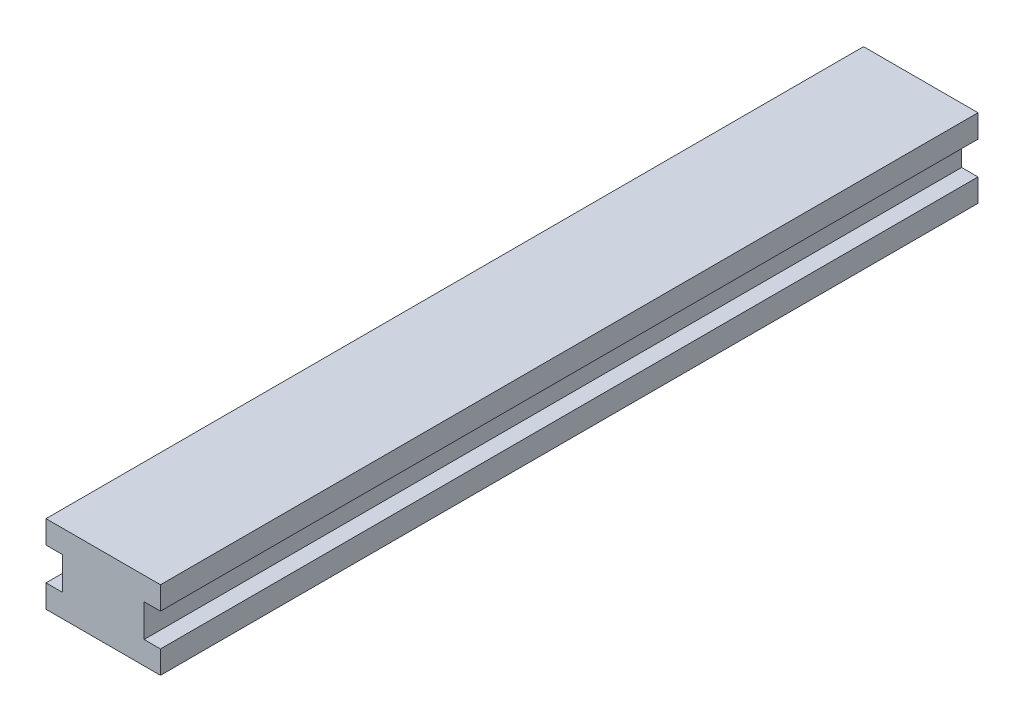
ISO-10303-21;
HEADER;
FILE_DESCRIPTION(('STEP AP214'),'2;1');
FILE_NAME('part.step','',(''),(''),'','','');
FILE_SCHEMA(('AUTOMOTIVE_DESIGN { 1 0 10303 214 1 1 1 1 }'));
ENDSEC;
DATA;
#1=APPLICATION_CONTEXT('core data for automotive mechanical design processes');
#2=APPLICATION_PROTOCOL_DEFINITION('international standard','automotive_design',2000,#1);
#3=PRODUCT_CONTEXT('',#1,'mechanical');
#4=PRODUCT('Part','Part','',(#3));
#5=PRODUCT_RELATED_PRODUCT_CATEGORY('part','',(#4));
#6=PRODUCT_DEFINITION_FORMATION('','',#4);
#7=PRODUCT_DEFINITION_CONTEXT('part definition',#1,'design');
#8=PRODUCT_DEFINITION('design','',#6,#7);
#9=PRODUCT_DEFINITION_SHAPE('','',#8);
#10=(LENGTH_UNIT() NAMED_UNIT(*) SI_UNIT(.MILLI.,.METRE.));
#11=(NAMED_UNIT(*) PLANE_ANGLE_UNIT() SI_UNIT($,.RADIAN.));
#12=(NAMED_UNIT(*) SI_UNIT($,.STERADIAN.) SOLID_ANGLE_UNIT());
#13=UNCERTAINTY_MEASURE_WITH_UNIT(LENGTH_MEASURE(1.E-05),#10,'distance_accuracy_value','');
#14=(GEOMETRIC_REPRESENTATION_CONTEXT(3) GLOBAL_UNCERTAINTY_ASSIGNED_CONTEXT((#13)) GLOBAL_UNIT_ASSIGNED_CONTEXT((#10,
#11,#12)) REPRESENTATION_CONTEXT('',''));
#15=CARTESIAN_POINT('',(0.,0.,0.));
#16=DIRECTION('',(0.,0.,1.));
#17=DIRECTION('',(1.,0.,0.));
#18=AXIS2_PLACEMENT_3D('',#15,#16,#17);
#19=CARTESIAN_POINT('',(0.,-0.999999999999999,50.));
#20=DIRECTION('',(0.,1.,0.));
#21=DIRECTION('',(-1.,0.,0.));
#22=AXIS2_PLACEMENT_3D('',#19,#20,#21);
#23=PLANE('',#22);
#24=DIRECTION('',(1.,0.,0.));
#25=VECTOR('',#24,1.);
#26=CARTESIAN_POINT('',(0.,-0.999999999999999,0.));
#27=LINE('',#26,#25);
#28=CARTESIAN_POINT('',(2.5,-1.,0.));
#29=VERTEX_POINT('',#28);
#30=CARTESIAN_POINT('',(3.5,-1.,0.));
#31=VERTEX_POINT('',#30);
#32=EDGE_CURVE('E194',#29,#31,#27,.T.);
#33=ORIENTED_EDGE('',*,*,#32,.F.);
#34=DIRECTION('',(0.,0.,-1.));
#35=VECTOR('',#34,1.);
#36=CARTESIAN_POINT('',(2.5,-1.,50.));
#37=LINE('',#36,#35);
#38=CARTESIAN_POINT('',(2.5,-1.,50.));
#39=VERTEX_POINT('',#38);
#40=EDGE_CURVE('E11',#39,#29,#37,.T.);
#41=ORIENTED_EDGE('',*,*,#40,.F.);
#42=DIRECTION('',(1.,0.,0.));
#43=VECTOR('',#42,1.);
#44=CARTESIAN_POINT('',(0.,-0.999999999999999,50.));
#45=LINE('',#44,#43);
#46=CARTESIAN_POINT('',(3.5,-1.,50.));
#47=VERTEX_POINT('',#46);
#48=EDGE_CURVE('E170',#39,#47,#45,.T.);
#49=ORIENTED_EDGE('',*,*,#48,.T.);
#50=DIRECTION('',(0.,0.,-1.));
#51=VECTOR('',#50,1.);
#52=CARTESIAN_POINT('',(3.5,-1.,50.));
#53=LINE('',#52,#51);
#54=EDGE_CURVE('E99',#47,#31,#53,.T.);
#55=ORIENTED_EDGE('',*,*,#54,.T.);
#56=EDGE_LOOP('',(#33,#41,#49,#55));
#57=FACE_BOUND('',#56,.T.);
#58=ADVANCED_FACE('F37',(#57),#23,.T.);
#59=CARTESIAN_POINT('',(2.5,0.,50.));
#60=DIRECTION('',(1.,0.,0.));
#61=DIRECTION('',(0.,0.,-1.));
#62=AXIS2_PLACEMENT_3D('',#59,#60,#61);
#63=PLANE('',#62);
#64=DIRECTION('',(0.,-1.,0.));
#65=VECTOR('',#64,1.);
#66=CARTESIAN_POINT('',(2.5,0.,0.));
#67=LINE('',#66,#65);
#68=CARTESIAN_POINT('',(2.5,1.,0.));
#69=VERTEX_POINT('',#68);
#70=EDGE_CURVE('E189',#69,#29,#67,.T.);
#71=ORIENTED_EDGE('',*,*,#70,.F.);
#72=DIRECTION('',(0.,0.,-1.));
#73=VECTOR('',#72,1.);
#74=CARTESIAN_POINT('',(2.5,1.,50.));
#75=LINE('',#74,#73);
#76=CARTESIAN_POINT('',(2.5,1.,50.));
#77=VERTEX_POINT('',#76);
#78=EDGE_CURVE('E45',#77,#69,#75,.T.);
#79=ORIENTED_EDGE('',*,*,#78,.F.);
#80=DIRECTION('',(0.,-1.,0.));
#81=VECTOR('',#80,1.);
#82=CARTESIAN_POINT('',(2.5,0.,50.));
#83=LINE('',#82,#81);
#84=EDGE_CURVE('E167',#77,#39,#83,.T.);
#85=ORIENTED_EDGE('',*,*,#84,.T.);
#86=ORIENTED_EDGE('',*,*,#40,.T.);
#87=EDGE_LOOP('',(#71,#79,#85,#86));
#88=FACE_BOUND('',#87,.T.);
#89=ADVANCED_FACE('F234',(#88),#63,.T.);
#90=CARTESIAN_POINT('',(0.,1.,50.));
#91=DIRECTION('',(0.,1.,0.));
#92=DIRECTION('',(0.,0.,1.));
#93=AXIS2_PLACEMENT_3D('',#90,#91,#92);
#94=PLANE('',#93);
#95=DIRECTION('',(1.,0.,0.));
#96=VECTOR('',#95,1.);
#97=CARTESIAN_POINT('',(0.,1.,0.));
#98=LINE('',#97,#96);
#99=CARTESIAN_POINT('',(3.5,1.,0.));
#100=VERTEX_POINT('',#99);
#101=EDGE_CURVE('E182',#69,#100,#98,.T.);
#102=ORIENTED_EDGE('',*,*,#101,.T.);
#103=DIRECTION('',(0.,0.,-1.));
#104=VECTOR('',#103,1.);
#105=CARTESIAN_POINT('',(3.5,1.,50.));
#106=LINE('',#105,#104);
#107=CARTESIAN_POINT('',(3.5,1.,50.));
#108=VERTEX_POINT('',#107);
#109=EDGE_CURVE('E226',#108,#100,#106,.T.);
#110=ORIENTED_EDGE('',*,*,#109,.F.);
#111=DIRECTION('',(1.,0.,0.));
#112=VECTOR('',#111,1.);
#113=CARTESIAN_POINT('',(0.,1.,50.));
#114=LINE('',#113,#112);
#115=EDGE_CURVE('E163',#77,#108,#114,.T.);
#116=ORIENTED_EDGE('',*,*,#115,.F.);
#117=ORIENTED_EDGE('',*,*,#78,.T.);
#118=EDGE_LOOP('',(#102,#110,#116,#117));
#119=FACE_BOUND('',#118,.T.);
#120=ADVANCED_FACE('F228',(#119),#94,.F.);
#121=CARTESIAN_POINT('',(3.5,0.,50.));
#122=DIRECTION('',(-1.,0.,0.));
#123=DIRECTION('',(0.,-1.,0.));
#124=AXIS2_PLACEMENT_3D('',#121,#122,#123);
#125=PLANE('',#124);
#126=DIRECTION('',(0.,1.,0.));
#127=VECTOR('',#126,1.);
#128=CARTESIAN_POINT('',(3.5,0.,0.));
#129=LINE('',#128,#127);
#130=CARTESIAN_POINT('',(3.5,2.4,0.));
#131=VERTEX_POINT('',#130);
#132=EDGE_CURVE('E173',#100,#131,#129,.T.);
#133=ORIENTED_EDGE('',*,*,#132,.T.);
#134=DIRECTION('',(0.,0.,-1.));
#135=VECTOR('',#134,1.);
#136=CARTESIAN_POINT('',(3.5,2.4,50.));
#137=LINE('',#136,#135);
#138=CARTESIAN_POINT('',(3.5,2.4,50.));
#139=VERTEX_POINT('',#138);
#140=EDGE_CURVE('E224',#139,#131,#137,.T.);
#141=ORIENTED_EDGE('',*,*,#140,.F.);
#142=DIRECTION('',(0.,1.,0.));
#143=VECTOR('',#142,1.);
#144=CARTESIAN_POINT('',(3.5,0.,50.));
#145=LINE('',#144,#143);
#146=EDGE_CURVE('E160',#108,#139,#145,.T.);
#147=ORIENTED_EDGE('',*,*,#146,.F.);
#148=ORIENTED_EDGE('',*,*,#109,.T.);
#149=EDGE_LOOP('',(#133,#141,#147,#148));
#150=FACE_BOUND('',#149,.T.);
#151=ADVANCED_FACE('F248',(#150),#125,.F.);
#152=CARTESIAN_POINT('',(0.,2.4,50.));
#153=DIRECTION('',(0.,1.,0.));
#154=DIRECTION('',(-1.,0.,0.));
#155=AXIS2_PLACEMENT_3D('',#152,#153,#154);
#156=PLANE('',#155);
#157=DIRECTION('',(1.,0.,0.));
#158=VECTOR('',#157,1.);
#159=CARTESIAN_POINT('',(0.,2.4,0.));
#160=LINE('',#159,#158);
#161=CARTESIAN_POINT('',(-3.5,2.4,0.));
#162=VERTEX_POINT('',#161);
#163=EDGE_CURVE('E181',#162,#131,#160,.T.);
#164=ORIENTED_EDGE('',*,*,#163,.F.);
#165=DIRECTION('',(0.,0.,-1.));
#166=VECTOR('',#165,1.);
#167=CARTESIAN_POINT('',(-3.5,2.4,50.));
#168=LINE('',#167,#166);
#169=CARTESIAN_POINT('',(-3.5,2.4,50.));
#170=VERTEX_POINT('',#169);
#171=EDGE_CURVE('E222',#170,#162,#168,.T.);
#172=ORIENTED_EDGE('',*,*,#171,.F.);
#173=DIRECTION('',(1.,0.,0.));
#174=VECTOR('',#173,1.);
#175=CARTESIAN_POINT('',(0.,2.4,50.));
#176=LINE('',#175,#174);
#177=EDGE_CURVE('E156',#170,#139,#176,.T.);
#178=ORIENTED_EDGE('',*,*,#177,.T.);
#179=ORIENTED_EDGE('',*,*,#140,.T.);
#180=EDGE_LOOP('',(#164,#172,#178,#179));
#181=FACE_BOUND('',#180,.T.);
#182=ADVANCED_FACE('F257',(#181),#156,.T.);
#183=CARTESIAN_POINT('',(-3.5,0.,50.));
#184=DIRECTION('',(-1.,0.,0.));
#185=DIRECTION('',(0.,-1.,0.));
#186=AXIS2_PLACEMENT_3D('',#183,#184,#185);
#187=PLANE('',#186);
#188=DIRECTION('',(0.,1.,0.));
#189=VECTOR('',#188,1.);
#190=CARTESIAN_POINT('',(-3.5,0.,0.));
#191=LINE('',#190,#189);
#192=CARTESIAN_POINT('',(-3.5,1.,0.));
#193=VERTEX_POINT('',#192);
#194=EDGE_CURVE('E188',#193,#162,#191,.T.);
#195=ORIENTED_EDGE('',*,*,#194,.F.);
#196=DIRECTION('',(0.,0.,-1.));
#197=VECTOR('',#196,1.);
#198=CARTESIAN_POINT('',(-3.5,1.,50.));
#199=LINE('',#198,#197);
#200=CARTESIAN_POINT('',(-3.5,1.,50.));
#201=VERTEX_POINT('',#200);
#202=EDGE_CURVE('E220',#201,#193,#199,.T.);
#203=ORIENTED_EDGE('',*,*,#202,.F.);
#204=DIRECTION('',(0.,1.,0.));
#205=VECTOR('',#204,1.);
#206=CARTESIAN_POINT('',(-3.5,0.,50.));
#207=LINE('',#206,#205);
#208=EDGE_CURVE('E149',#201,#170,#207,.T.);
#209=ORIENTED_EDGE('',*,*,#208,.T.);
#210=ORIENTED_EDGE('',*,*,#171,.T.);
#211=EDGE_LOOP('',(#195,#203,#209,#210));
#212=FACE_BOUND('',#211,.T.);
#213=ADVANCED_FACE('F269',(#212),#187,.T.);
#214=CARTESIAN_POINT('',(0.,1.,50.));
#215=DIRECTION('',(0.,1.,0.));
#216=DIRECTION('',(0.,0.,1.));
#217=AXIS2_PLACEMENT_3D('',#214,#215,#216);
#218=PLANE('',#217);
#219=DIRECTION('',(1.,0.,0.));
#220=VECTOR('',#219,1.);
#221=CARTESIAN_POINT('',(0.,1.,0.));
#222=LINE('',#221,#220);
#223=CARTESIAN_POINT('',(-2.5,1.,0.));
#224=VERTEX_POINT('',#223);
#225=EDGE_CURVE('E239',#193,#224,#222,.T.);
#226=ORIENTED_EDGE('',*,*,#225,.T.);
#227=DIRECTION('',(0.,0.,-1.));
#228=VECTOR('',#227,1.);
#229=CARTESIAN_POINT('',(-2.5,1.,50.));
#230=LINE('',#229,#228);
#231=CARTESIAN_POINT('',(-2.5,1.,50.));
#232=VERTEX_POINT('',#231);
#233=EDGE_CURVE('E212',#232,#224,#230,.T.);
#234=ORIENTED_EDGE('',*,*,#233,.F.);
#235=DIRECTION('',(1.,0.,0.));
#236=VECTOR('',#235,1.);
#237=CARTESIAN_POINT('',(0.,1.,50.));
#238=LINE('',#237,#236);
#239=EDGE_CURVE('E155',#201,#232,#238,.T.);
#240=ORIENTED_EDGE('',*,*,#239,.F.);
#241=ORIENTED_EDGE('',*,*,#202,.T.);
#242=EDGE_LOOP('',(#226,#234,#240,#241));
#243=FACE_BOUND('',#242,.T.);
#244=ADVANCED_FACE('F270',(#243),#218,.F.);
#245=CARTESIAN_POINT('',(-2.5,0.,50.));
#246=DIRECTION('',(1.,0.,0.));
#247=DIRECTION('',(0.,0.,-1.));
#248=AXIS2_PLACEMENT_3D('',#245,#246,#247);
#249=PLANE('',#248);
#250=DIRECTION('',(0.,-1.,0.));
#251=VECTOR('',#250,1.);
#252=CARTESIAN_POINT('',(-2.5,0.,0.));
#253=LINE('',#252,#251);
#254=CARTESIAN_POINT('',(-2.5,-1.,0.));
#255=VERTEX_POINT('',#254);
#256=EDGE_CURVE('E208',#224,#255,#253,.T.);
#257=ORIENTED_EDGE('',*,*,#256,.T.);
#258=DIRECTION('',(0.,0.,-1.));
#259=VECTOR('',#258,1.);
#260=CARTESIAN_POINT('',(-2.5,-1.,50.));
#261=LINE('',#260,#259);
#262=CARTESIAN_POINT('',(-2.5,-1.,50.));
#263=VERTEX_POINT('',#262);
#264=EDGE_CURVE('E205',#263,#255,#261,.T.);
#265=ORIENTED_EDGE('',*,*,#264,.F.);
#266=DIRECTION('',(0.,-1.,0.));
#267=VECTOR('',#266,1.);
#268=CARTESIAN_POINT('',(-2.5,0.,50.));
#269=LINE('',#268,#267);
#270=EDGE_CURVE('E150',#232,#263,#269,.T.);
#271=ORIENTED_EDGE('',*,*,#270,.F.);
#272=ORIENTED_EDGE('',*,*,#233,.T.);
#273=EDGE_LOOP('',(#257,#265,#271,#272));
#274=FACE_BOUND('',#273,.T.);
#275=ADVANCED_FACE('F206',(#274),#249,.F.);
#276=CARTESIAN_POINT('',(0.,-1.,50.));
#277=DIRECTION('',(0.,1.,0.));
#278=DIRECTION('',(0.,0.,1.));
#279=AXIS2_PLACEMENT_3D('',#276,#277,#278);
#280=PLANE('',#279);
#281=DIRECTION('',(1.,0.,0.));
#282=VECTOR('',#281,1.);
#283=CARTESIAN_POINT('',(0.,-1.,0.));
#284=LINE('',#283,#282);
#285=CARTESIAN_POINT('',(-3.5,-1.,0.));
#286=VERTEX_POINT('',#285);
#287=EDGE_CURVE('E215',#286,#255,#284,.T.);
#288=ORIENTED_EDGE('',*,*,#287,.F.);
#289=DIRECTION('',(0.,0.,-1.));
#290=VECTOR('',#289,1.);
#291=CARTESIAN_POINT('',(-3.5,-1.,50.));
#292=LINE('',#291,#290);
#293=CARTESIAN_POINT('',(-3.5,-1.,50.));
#294=VERTEX_POINT('',#293);
#295=EDGE_CURVE('E138',#294,#286,#292,.T.);
#296=ORIENTED_EDGE('',*,*,#295,.F.);
#297=DIRECTION('',(1.,0.,0.));
#298=VECTOR('',#297,1.);
#299=CARTESIAN_POINT('',(0.,-1.,50.));
#300=LINE('',#299,#298);
#301=EDGE_CURVE('E147',#294,#263,#300,.T.);
#302=ORIENTED_EDGE('',*,*,#301,.T.);
#303=ORIENTED_EDGE('',*,*,#264,.T.);
#304=EDGE_LOOP('',(#288,#296,#302,#303));
#305=FACE_BOUND('',#304,.T.);
#306=ADVANCED_FACE('F214',(#305),#280,.T.);
#307=CARTESIAN_POINT('',(-3.5,-2.4,0.));
#308=VERTEX_POINT('',#307);
#309=EDGE_CURVE('E137',#308,#286,#191,.T.);
#310=ORIENTED_EDGE('',*,*,#309,.F.);
#311=DIRECTION('',(0.,0.,-1.));
#312=VECTOR('',#311,1.);
#313=CARTESIAN_POINT('',(-3.5,-2.4,50.));
#314=LINE('',#313,#312);
#315=CARTESIAN_POINT('',(-3.5,-2.4,50.));
#316=VERTEX_POINT('',#315);
#317=EDGE_CURVE('E131',#316,#308,#314,.T.);
#318=ORIENTED_EDGE('',*,*,#317,.F.);
#319=EDGE_CURVE('E135',#316,#294,#207,.T.);
#320=ORIENTED_EDGE('',*,*,#319,.T.);
#321=ORIENTED_EDGE('',*,*,#295,.T.);
#322=EDGE_LOOP('',(#310,#318,#320,#321));
#323=FACE_BOUND('',#322,.T.);
#324=ADVANCED_FACE('F133',(#323),#187,.T.);
#325=CARTESIAN_POINT('',(0.,-2.4,50.));
#326=DIRECTION('',(0.,1.,0.));
#327=DIRECTION('',(0.,0.,1.));
#328=AXIS2_PLACEMENT_3D('',#325,#326,#327);
#329=PLANE('',#328);
#330=DIRECTION('',(1.,0.,0.));
#331=VECTOR('',#330,1.);
#332=CARTESIAN_POINT('',(0.,-2.4,0.));
#333=LINE('',#332,#331);
#334=CARTESIAN_POINT('',(3.5,-2.4,0.));
#335=VERTEX_POINT('',#334);
#336=EDGE_CURVE('E92',#308,#335,#333,.T.);
#337=ORIENTED_EDGE('',*,*,#336,.T.);
#338=DIRECTION('',(0.,0.,-1.));
#339=VECTOR('',#338,1.);
#340=CARTESIAN_POINT('',(3.5,-2.4,50.));
#341=LINE('',#340,#339);
#342=CARTESIAN_POINT('',(3.5,-2.4,50.));
#343=VERTEX_POINT('',#342);
#344=EDGE_CURVE('E139',#343,#335,#341,.T.);
#345=ORIENTED_EDGE('',*,*,#344,.F.);
#346=DIRECTION('',(1.,0.,0.));
#347=VECTOR('',#346,1.);
#348=CARTESIAN_POINT('',(0.,-2.4,50.));
#349=LINE('',#348,#347);
#350=EDGE_CURVE('E141',#316,#343,#349,.T.);
#351=ORIENTED_EDGE('',*,*,#350,.F.);
#352=ORIENTED_EDGE('',*,*,#317,.T.);
#353=EDGE_LOOP('',(#337,#345,#351,#352));
#354=FACE_BOUND('',#353,.T.);
#355=ADVANCED_FACE('F142',(#354),#329,.F.);
#356=EDGE_CURVE('E171',#335,#31,#129,.T.);
#357=ORIENTED_EDGE('',*,*,#356,.T.);
#358=ORIENTED_EDGE('',*,*,#54,.F.);
#359=EDGE_CURVE('E53',#343,#47,#145,.T.);
#360=ORIENTED_EDGE('',*,*,#359,.F.);
#361=ORIENTED_EDGE('',*,*,#344,.T.);
#362=EDGE_LOOP('',(#357,#358,#360,#361));
#363=FACE_BOUND('',#362,.T.);
#364=ADVANCED_FACE('F245',(#363),#125,.F.);
#365=CARTESIAN_POINT('',(0.,0.,50.));
#366=DIRECTION('',(0.,0.,1.));
#367=DIRECTION('',(1.,0.,0.));
#368=AXIS2_PLACEMENT_3D('',#365,#366,#367);
#369=PLANE('',#368);
#370=ORIENTED_EDGE('',*,*,#48,.F.);
#371=ORIENTED_EDGE('',*,*,#84,.F.);
#372=ORIENTED_EDGE('',*,*,#115,.T.);
#373=ORIENTED_EDGE('',*,*,#146,.T.);
#374=ORIENTED_EDGE('',*,*,#177,.F.);
#375=ORIENTED_EDGE('',*,*,#208,.F.);
#376=ORIENTED_EDGE('',*,*,#239,.T.);
#377=ORIENTED_EDGE('',*,*,#270,.T.);
#378=ORIENTED_EDGE('',*,*,#301,.F.);
#379=ORIENTED_EDGE('',*,*,#319,.F.);
#380=ORIENTED_EDGE('',*,*,#350,.T.);
#381=ORIENTED_EDGE('',*,*,#359,.T.);
#382=EDGE_LOOP('',(#370,#371,#372,#373,#374,#375,#376,#377,#378,#379,#380,#381));
#383=FACE_BOUND('',#382,.T.);
#384=ADVANCED_FACE('F145',(#383),#369,.T.);
#385=CARTESIAN_POINT('',(0.,0.,0.));
#386=DIRECTION('',(0.,0.,1.));
#387=DIRECTION('',(1.,0.,0.));
#388=AXIS2_PLACEMENT_3D('',#385,#386,#387);
#389=PLANE('',#388);
#390=ORIENTED_EDGE('',*,*,#32,.T.);
#391=ORIENTED_EDGE('',*,*,#356,.F.);
#392=ORIENTED_EDGE('',*,*,#336,.F.);
#393=ORIENTED_EDGE('',*,*,#309,.T.);
#394=ORIENTED_EDGE('',*,*,#287,.T.);
#395=ORIENTED_EDGE('',*,*,#256,.F.);
#396=ORIENTED_EDGE('',*,*,#225,.F.);
#397=ORIENTED_EDGE('',*,*,#194,.T.);
#398=ORIENTED_EDGE('',*,*,#163,.T.);
#399=ORIENTED_EDGE('',*,*,#132,.F.);
#400=ORIENTED_EDGE('',*,*,#101,.F.);
#401=ORIENTED_EDGE('',*,*,#70,.T.);
#402=EDGE_LOOP('',(#390,#391,#392,#393,#394,#395,#396,#397,#398,#399,#400,#401));
#403=FACE_BOUND('',#402,.T.);
#404=ADVANCED_FACE('F233',(#403),#389,.F.);
#405=CLOSED_SHELL('',(#58,#89,#120,#151,#182,#213,#244,#275,#306,#324,#355,#364,#384,#404));
#406=MANIFOLD_SOLID_BREP('B2',#405);
#407=ADVANCED_BREP_SHAPE_REPRESENTATION('',(#18,#406),#14);
#408=SHAPE_DEFINITION_REPRESENTATION(#9,#407);
ENDSEC;
END-ISO-10303-21;
